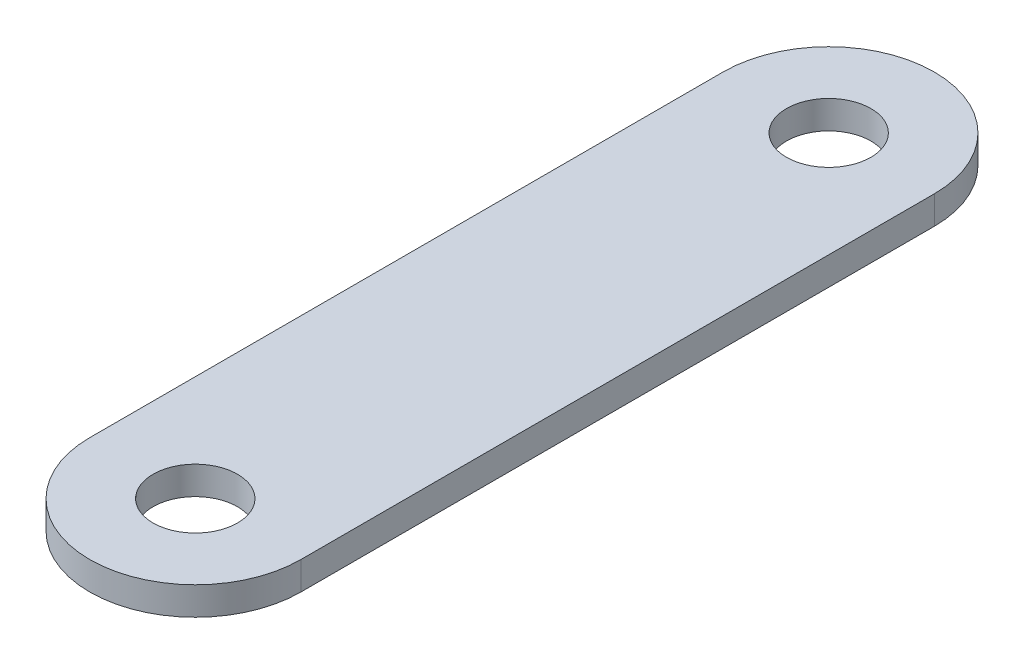
ISO-10303-21;
HEADER;
FILE_DESCRIPTION(('STEP AP214'),'2;1');
FILE_NAME('part.step','',(''),(''),'','','');
FILE_SCHEMA(('AUTOMOTIVE_DESIGN { 1 0 10303 214 1 1 1 1 }'));
ENDSEC;
DATA;
#1=APPLICATION_CONTEXT('core data for automotive mechanical design processes');
#2=APPLICATION_PROTOCOL_DEFINITION('international standard','automotive_design',2000,#1);
#3=PRODUCT_CONTEXT('',#1,'mechanical');
#4=PRODUCT('Part','Part','',(#3));
#5=PRODUCT_RELATED_PRODUCT_CATEGORY('part','',(#4));
#6=PRODUCT_DEFINITION_FORMATION('','',#4);
#7=PRODUCT_DEFINITION_CONTEXT('part definition',#1,'design');
#8=PRODUCT_DEFINITION('design','',#6,#7);
#9=PRODUCT_DEFINITION_SHAPE('','',#8);
#10=(LENGTH_UNIT() NAMED_UNIT(*) SI_UNIT(.MILLI.,.METRE.));
#11=(NAMED_UNIT(*) PLANE_ANGLE_UNIT() SI_UNIT($,.RADIAN.));
#12=(NAMED_UNIT(*) SI_UNIT($,.STERADIAN.) SOLID_ANGLE_UNIT());
#13=UNCERTAINTY_MEASURE_WITH_UNIT(LENGTH_MEASURE(1.E-05),#10,'distance_accuracy_value','');
#14=(GEOMETRIC_REPRESENTATION_CONTEXT(3) GLOBAL_UNCERTAINTY_ASSIGNED_CONTEXT((#13)) GLOBAL_UNIT_ASSIGNED_CONTEXT((#10,
#11,#12)) REPRESENTATION_CONTEXT('',''));
#15=CARTESIAN_POINT('',(0.,0.,0.));
#16=DIRECTION('',(0.,0.,1.));
#17=DIRECTION('',(1.,0.,0.));
#18=AXIS2_PLACEMENT_3D('',#15,#16,#17);
#19=CARTESIAN_POINT('',(0.,2.,22.5));
#20=DIRECTION('',(0.,1.,0.));
#21=DIRECTION('',(0.,0.,1.));
#22=AXIS2_PLACEMENT_3D('',#19,#20,#21);
#23=PLANE('',#22);
#24=CARTESIAN_POINT('',(0.,2.,-22.5));
#25=DIRECTION('',(0.,1.,0.));
#26=DIRECTION('',(0.,0.,1.));
#27=AXIS2_PLACEMENT_3D('',#24,#25,#26);
#28=CIRCLE('',#27,3.);
#29=CARTESIAN_POINT('',(0.,2.,-19.5));
#30=VERTEX_POINT('',#29);
#31=EDGE_CURVE('E102',#30,#30,#28,.T.);
#32=ORIENTED_EDGE('',*,*,#31,.F.);
#33=EDGE_LOOP('',(#32));
#34=FACE_BOUND('',#33,.T.);
#35=CARTESIAN_POINT('',(0.,2.,22.5));
#36=DIRECTION('',(0.,1.,0.));
#37=DIRECTION('',(0.,0.,1.));
#38=AXIS2_PLACEMENT_3D('',#35,#36,#37);
#39=CIRCLE('',#38,7.5);
#40=CARTESIAN_POINT('',(-7.50000000000001,2.,22.5));
#41=VERTEX_POINT('',#40);
#42=CARTESIAN_POINT('',(7.49999999999999,2.,22.5));
#43=VERTEX_POINT('',#42);
#44=EDGE_CURVE('E87',#41,#43,#39,.T.);
#45=ORIENTED_EDGE('',*,*,#44,.T.);
#46=DIRECTION('',(0.,0.,-1.));
#47=VECTOR('',#46,1.);
#48=CARTESIAN_POINT('',(7.49999999999999,2.,22.5));
#49=LINE('',#48,#47);
#50=CARTESIAN_POINT('',(7.49999999999999,2.,-22.5));
#51=VERTEX_POINT('',#50);
#52=EDGE_CURVE('E82',#43,#51,#49,.T.);
#53=ORIENTED_EDGE('',*,*,#52,.T.);
#54=CARTESIAN_POINT('',(0.,2.,-22.5));
#55=DIRECTION('',(0.,1.,0.));
#56=DIRECTION('',(0.,0.,1.));
#57=AXIS2_PLACEMENT_3D('',#54,#55,#56);
#58=CIRCLE('',#57,7.5);
#59=CARTESIAN_POINT('',(-7.5,2.,-22.5));
#60=VERTEX_POINT('',#59);
#61=EDGE_CURVE('E85',#51,#60,#58,.T.);
#62=ORIENTED_EDGE('',*,*,#61,.T.);
#63=DIRECTION('',(0.,0.,1.));
#64=VECTOR('',#63,1.);
#65=CARTESIAN_POINT('',(-7.50000000000001,2.,22.5));
#66=LINE('',#65,#64);
#67=EDGE_CURVE('E52',#60,#41,#66,.T.);
#68=ORIENTED_EDGE('',*,*,#67,.T.);
#69=EDGE_LOOP('',(#45,#53,#62,#68));
#70=FACE_BOUND('',#69,.T.);
#71=CARTESIAN_POINT('',(0.,2.,22.5));
#72=DIRECTION('',(0.,1.,0.));
#73=DIRECTION('',(0.,0.,1.));
#74=AXIS2_PLACEMENT_3D('',#71,#72,#73);
#75=CIRCLE('',#74,3.);
#76=CARTESIAN_POINT('',(0.,2.,25.5));
#77=VERTEX_POINT('',#76);
#78=EDGE_CURVE('E117',#77,#77,#75,.T.);
#79=ORIENTED_EDGE('',*,*,#78,.F.);
#80=EDGE_LOOP('',(#79));
#81=FACE_BOUND('',#80,.T.);
#82=ADVANCED_FACE('F35',(#34,#70,#81),#23,.T.);
#83=CARTESIAN_POINT('',(0.,0.,22.5));
#84=DIRECTION('',(0.,1.,0.));
#85=DIRECTION('',(0.,0.,1.));
#86=AXIS2_PLACEMENT_3D('',#83,#84,#85);
#87=PLANE('',#86);
#88=CARTESIAN_POINT('',(0.,0.,22.5));
#89=DIRECTION('',(0.,1.,0.));
#90=DIRECTION('',(0.,0.,1.));
#91=AXIS2_PLACEMENT_3D('',#88,#89,#90);
#92=CIRCLE('',#91,7.5);
#93=CARTESIAN_POINT('',(-7.50000000000001,0.,22.5));
#94=VERTEX_POINT('',#93);
#95=CARTESIAN_POINT('',(7.49999999999999,0.,22.5));
#96=VERTEX_POINT('',#95);
#97=EDGE_CURVE('E99',#94,#96,#92,.T.);
#98=ORIENTED_EDGE('',*,*,#97,.F.);
#99=DIRECTION('',(0.,0.,1.));
#100=VECTOR('',#99,1.);
#101=CARTESIAN_POINT('',(-7.50000000000001,0.,22.5));
#102=LINE('',#101,#100);
#103=CARTESIAN_POINT('',(-7.5,0.,-22.5));
#104=VERTEX_POINT('',#103);
#105=EDGE_CURVE('E75',#104,#94,#102,.T.);
#106=ORIENTED_EDGE('',*,*,#105,.F.);
#107=CARTESIAN_POINT('',(0.,0.,-22.5));
#108=DIRECTION('',(0.,1.,0.));
#109=DIRECTION('',(0.,0.,1.));
#110=AXIS2_PLACEMENT_3D('',#107,#108,#109);
#111=CIRCLE('',#110,7.5);
#112=CARTESIAN_POINT('',(7.49999999999999,0.,-22.5));
#113=VERTEX_POINT('',#112);
#114=EDGE_CURVE('E69',#113,#104,#111,.T.);
#115=ORIENTED_EDGE('',*,*,#114,.F.);
#116=DIRECTION('',(0.,0.,-1.));
#117=VECTOR('',#116,1.);
#118=CARTESIAN_POINT('',(7.49999999999999,0.,22.5));
#119=LINE('',#118,#117);
#120=EDGE_CURVE('E91',#96,#113,#119,.T.);
#121=ORIENTED_EDGE('',*,*,#120,.F.);
#122=EDGE_LOOP('',(#98,#106,#115,#121));
#123=FACE_BOUND('',#122,.T.);
#124=CARTESIAN_POINT('',(0.,0.,-22.5));
#125=DIRECTION('',(0.,1.,0.));
#126=DIRECTION('',(0.,0.,1.));
#127=AXIS2_PLACEMENT_3D('',#124,#125,#126);
#128=CIRCLE('',#127,3.);
#129=CARTESIAN_POINT('',(0.,0.,-19.5));
#130=VERTEX_POINT('',#129);
#131=EDGE_CURVE('E114',#130,#130,#128,.T.);
#132=ORIENTED_EDGE('',*,*,#131,.T.);
#133=EDGE_LOOP('',(#132));
#134=FACE_BOUND('',#133,.T.);
#135=CARTESIAN_POINT('',(0.,0.,22.5));
#136=DIRECTION('',(0.,1.,0.));
#137=DIRECTION('',(0.,0.,1.));
#138=AXIS2_PLACEMENT_3D('',#135,#136,#137);
#139=CIRCLE('',#138,3.);
#140=CARTESIAN_POINT('',(0.,0.,25.5));
#141=VERTEX_POINT('',#140);
#142=EDGE_CURVE('E120',#141,#141,#139,.T.);
#143=ORIENTED_EDGE('',*,*,#142,.T.);
#144=EDGE_LOOP('',(#143));
#145=FACE_BOUND('',#144,.T.);
#146=ADVANCED_FACE('F110',(#123,#134,#145),#87,.F.);
#147=CARTESIAN_POINT('',(0.,2.,22.5));
#148=DIRECTION('',(0.,-1.,0.));
#149=DIRECTION('',(0.,0.,-1.));
#150=AXIS2_PLACEMENT_3D('',#147,#148,#149);
#151=CYLINDRICAL_SURFACE('',#150,7.5);
#152=ORIENTED_EDGE('',*,*,#97,.T.);
#153=DIRECTION('',(0.,-1.,0.));
#154=VECTOR('',#153,1.);
#155=CARTESIAN_POINT('',(7.49999999999999,2.,22.5));
#156=LINE('',#155,#154);
#157=EDGE_CURVE('E11',#43,#96,#156,.T.);
#158=ORIENTED_EDGE('',*,*,#157,.F.);
#159=ORIENTED_EDGE('',*,*,#44,.F.);
#160=DIRECTION('',(0.,-1.,0.));
#161=VECTOR('',#160,1.);
#162=CARTESIAN_POINT('',(-7.50000000000001,2.,22.5));
#163=LINE('',#162,#161);
#164=EDGE_CURVE('E95',#41,#94,#163,.T.);
#165=ORIENTED_EDGE('',*,*,#164,.T.);
#166=EDGE_LOOP('',(#152,#158,#159,#165));
#167=FACE_BOUND('',#166,.T.);
#168=ADVANCED_FACE('F37',(#167),#151,.T.);
#169=CARTESIAN_POINT('',(7.49999999999999,2.,22.5));
#170=DIRECTION('',(-1.,0.,0.));
#171=DIRECTION('',(0.,0.,1.));
#172=AXIS2_PLACEMENT_3D('',#169,#170,#171);
#173=PLANE('',#172);
#174=ORIENTED_EDGE('',*,*,#120,.T.);
#175=DIRECTION('',(0.,-1.,0.));
#176=VECTOR('',#175,1.);
#177=CARTESIAN_POINT('',(7.49999999999999,2.,-22.5));
#178=LINE('',#177,#176);
#179=EDGE_CURVE('E44',#51,#113,#178,.T.);
#180=ORIENTED_EDGE('',*,*,#179,.F.);
#181=ORIENTED_EDGE('',*,*,#52,.F.);
#182=ORIENTED_EDGE('',*,*,#157,.T.);
#183=EDGE_LOOP('',(#174,#180,#181,#182));
#184=FACE_BOUND('',#183,.T.);
#185=ADVANCED_FACE('F90',(#184),#173,.F.);
#186=CARTESIAN_POINT('',(0.,2.,-22.5));
#187=DIRECTION('',(0.,-1.,0.));
#188=DIRECTION('',(0.,0.,-1.));
#189=AXIS2_PLACEMENT_3D('',#186,#187,#188);
#190=CYLINDRICAL_SURFACE('',#189,7.5);
#191=ORIENTED_EDGE('',*,*,#114,.T.);
#192=DIRECTION('',(0.,-1.,0.));
#193=VECTOR('',#192,1.);
#194=CARTESIAN_POINT('',(-7.5,2.,-22.5));
#195=LINE('',#194,#193);
#196=EDGE_CURVE('E92',#60,#104,#195,.T.);
#197=ORIENTED_EDGE('',*,*,#196,.F.);
#198=ORIENTED_EDGE('',*,*,#61,.F.);
#199=ORIENTED_EDGE('',*,*,#179,.T.);
#200=EDGE_LOOP('',(#191,#197,#198,#199));
#201=FACE_BOUND('',#200,.T.);
#202=ADVANCED_FACE('F93',(#201),#190,.T.);
#203=CARTESIAN_POINT('',(-7.50000000000001,2.,22.5));
#204=DIRECTION('',(1.,0.,0.));
#205=DIRECTION('',(0.,0.,-1.));
#206=AXIS2_PLACEMENT_3D('',#203,#204,#205);
#207=PLANE('',#206);
#208=ORIENTED_EDGE('',*,*,#105,.T.);
#209=ORIENTED_EDGE('',*,*,#164,.F.);
#210=ORIENTED_EDGE('',*,*,#67,.F.);
#211=ORIENTED_EDGE('',*,*,#196,.T.);
#212=EDGE_LOOP('',(#208,#209,#210,#211));
#213=FACE_BOUND('',#212,.T.);
#214=ADVANCED_FACE('F107',(#213),#207,.F.);
#215=CARTESIAN_POINT('',(0.,2.,-22.5));
#216=DIRECTION('',(0.,-1.,0.));
#217=DIRECTION('',(0.,0.,-1.));
#218=AXIS2_PLACEMENT_3D('',#215,#216,#217);
#219=CYLINDRICAL_SURFACE('',#218,3.);
#220=ORIENTED_EDGE('',*,*,#31,.T.);
#221=EDGE_LOOP('',(#220));
#222=FACE_BOUND('',#221,.T.);
#223=ORIENTED_EDGE('',*,*,#131,.F.);
#224=EDGE_LOOP('',(#223));
#225=FACE_BOUND('',#224,.T.);
#226=ADVANCED_FACE('F137',(#222,#225),#219,.F.);
#227=CARTESIAN_POINT('',(0.,2.,22.5));
#228=DIRECTION('',(0.,-1.,0.));
#229=DIRECTION('',(0.,0.,-1.));
#230=AXIS2_PLACEMENT_3D('',#227,#228,#229);
#231=CYLINDRICAL_SURFACE('',#230,3.);
#232=ORIENTED_EDGE('',*,*,#78,.T.);
#233=EDGE_LOOP('',(#232));
#234=FACE_BOUND('',#233,.T.);
#235=ORIENTED_EDGE('',*,*,#142,.F.);
#236=EDGE_LOOP('',(#235));
#237=FACE_BOUND('',#236,.T.);
#238=ADVANCED_FACE('F126',(#234,#237),#231,.F.);
#239=CLOSED_SHELL('',(#82,#146,#168,#185,#202,#214,#226,#238));
#240=MANIFOLD_SOLID_BREP('B2',#239);
#241=ADVANCED_BREP_SHAPE_REPRESENTATION('',(#18,#240),#14);
#242=SHAPE_DEFINITION_REPRESENTATION(#9,#241);
ENDSEC;
END-ISO-10303-21;
